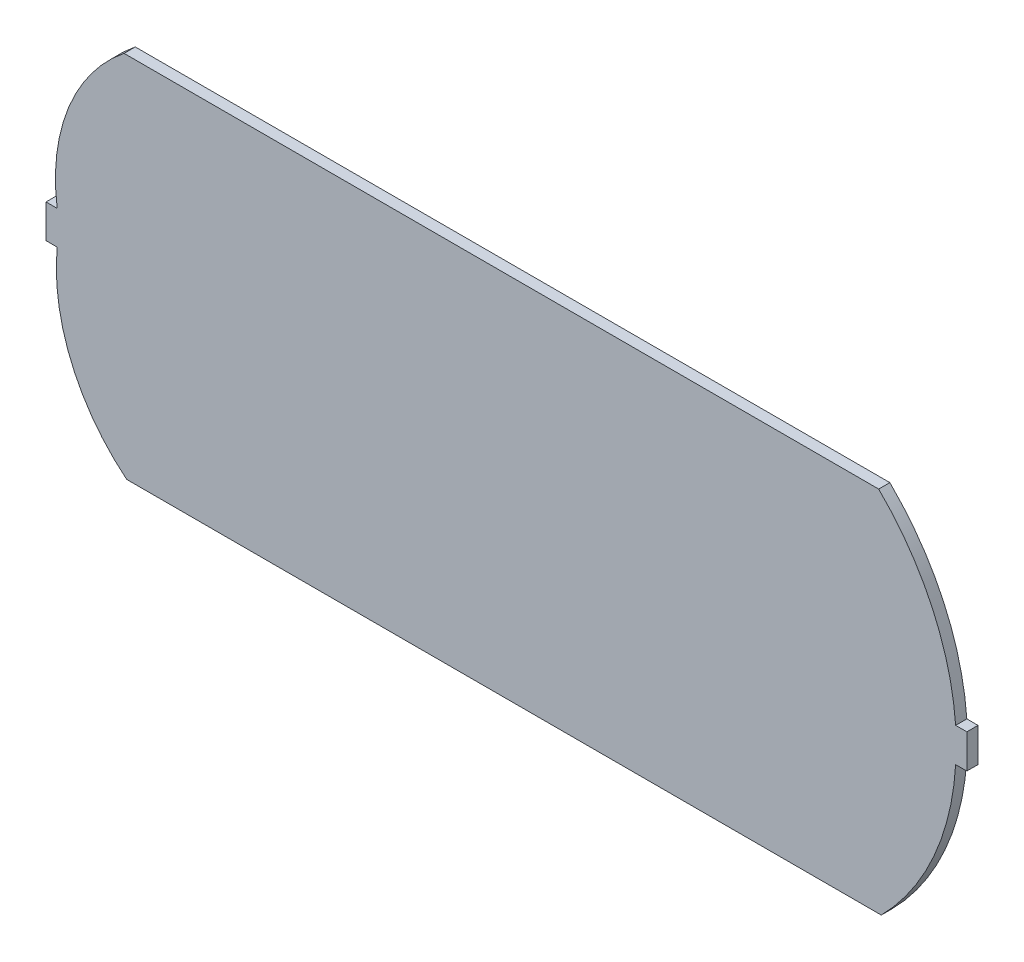
ISO-10303-21;
HEADER;
FILE_DESCRIPTION(('STEP AP214'),'2;1');
FILE_NAME('part.step','',(''),(''),'','','');
FILE_SCHEMA(('AUTOMOTIVE_DESIGN { 1 0 10303 214 1 1 1 1 }'));
ENDSEC;
DATA;
#1=APPLICATION_CONTEXT('core data for automotive mechanical design processes');
#2=APPLICATION_PROTOCOL_DEFINITION('international standard','automotive_design',2000,#1);
#3=PRODUCT_CONTEXT('',#1,'mechanical');
#4=PRODUCT('Part','Part','',(#3));
#5=PRODUCT_RELATED_PRODUCT_CATEGORY('part','',(#4));
#6=PRODUCT_DEFINITION_FORMATION('','',#4);
#7=PRODUCT_DEFINITION_CONTEXT('part definition',#1,'design');
#8=PRODUCT_DEFINITION('design','',#6,#7);
#9=PRODUCT_DEFINITION_SHAPE('','',#8);
#10=(LENGTH_UNIT() NAMED_UNIT(*) SI_UNIT(.MILLI.,.METRE.));
#11=(NAMED_UNIT(*) PLANE_ANGLE_UNIT() SI_UNIT($,.RADIAN.));
#12=(NAMED_UNIT(*) SI_UNIT($,.STERADIAN.) SOLID_ANGLE_UNIT());
#13=UNCERTAINTY_MEASURE_WITH_UNIT(LENGTH_MEASURE(1.E-05),#10,'distance_accuracy_value','');
#14=(GEOMETRIC_REPRESENTATION_CONTEXT(3) GLOBAL_UNCERTAINTY_ASSIGNED_CONTEXT((#13)) GLOBAL_UNIT_ASSIGNED_CONTEXT((#10,
#11,#12)) REPRESENTATION_CONTEXT('',''));
#15=CARTESIAN_POINT('',(0.,0.,0.));
#16=DIRECTION('',(0.,0.,1.));
#17=DIRECTION('',(1.,0.,0.));
#18=AXIS2_PLACEMENT_3D('',#15,#16,#17);
#19=CARTESIAN_POINT('',(0.,-18.8501046672825,1.));
#20=DIRECTION('',(0.,-1.,0.));
#21=DIRECTION('',(0.,0.,-1.));
#22=AXIS2_PLACEMENT_3D('',#19,#20,#21);
#23=PLANE('',#22);
#24=DIRECTION('',(-1.,0.,0.));
#25=VECTOR('',#24,1.);
#26=CARTESIAN_POINT('',(0.,-18.8501046672825,0.));
#27=LINE('',#26,#25);
#28=CARTESIAN_POINT('',(14.4606749125582,-18.8501046672825,0.));
#29=VERTEX_POINT('',#28);
#30=CARTESIAN_POINT('',(13.4606749125582,-18.8501046672825,0.));
#31=VERTEX_POINT('',#30);
#32=EDGE_CURVE('E152',#29,#31,#27,.T.);
#33=ORIENTED_EDGE('',*,*,#32,.F.);
#34=DIRECTION('',(0.,0.,-1.));
#35=VECTOR('',#34,1.);
#36=CARTESIAN_POINT('',(14.4606749125582,-18.8501046672825,1.));
#37=LINE('',#36,#35);
#38=CARTESIAN_POINT('',(14.4606749125582,-18.8501046672825,1.));
#39=VERTEX_POINT('',#38);
#40=EDGE_CURVE('E11',#39,#29,#37,.T.);
#41=ORIENTED_EDGE('',*,*,#40,.F.);
#42=DIRECTION('',(-1.,0.,0.));
#43=VECTOR('',#42,1.);
#44=CARTESIAN_POINT('',(0.,-18.8501046672825,1.));
#45=LINE('',#44,#43);
#46=CARTESIAN_POINT('',(13.4606749125582,-18.8501046672825,1.));
#47=VERTEX_POINT('',#46);
#48=EDGE_CURVE('E182',#39,#47,#45,.T.);
#49=ORIENTED_EDGE('',*,*,#48,.T.);
#50=DIRECTION('',(0.,0.,-1.));
#51=VECTOR('',#50,1.);
#52=CARTESIAN_POINT('',(13.4606749125582,-18.8501046672825,1.));
#53=LINE('',#52,#51);
#54=EDGE_CURVE('E50',#47,#31,#53,.T.);
#55=ORIENTED_EDGE('',*,*,#54,.T.);
#56=EDGE_LOOP('',(#33,#41,#49,#55));
#57=FACE_BOUND('',#56,.T.);
#58=ADVANCED_FACE('F34',(#57),#23,.T.);
#59=CARTESIAN_POINT('',(31.4749559150568,-20.4889749515505,1.));
#60=DIRECTION('',(0.,0.,-1.));
#61=DIRECTION('',(-1.,0.,0.));
#62=AXIS2_PLACEMENT_3D('',#59,#60,#61);
#63=CYLINDRICAL_SURFACE('',#62,17.0930293933125);
#64=CARTESIAN_POINT('',(31.4749559150568,-20.4889749515505,0.));
#65=DIRECTION('',(0.,0.,1.));
#66=DIRECTION('',(1.,0.,0.));
#67=AXIS2_PLACEMENT_3D('',#64,#65,#66);
#68=CIRCLE('',#67,17.0930293933125);
#69=CARTESIAN_POINT('',(20.6760281548959,-33.7386848756006,0.));
#70=VERTEX_POINT('',#69);
#71=EDGE_CURVE('E154',#29,#70,#68,.T.);
#72=ORIENTED_EDGE('',*,*,#71,.T.);
#73=DIRECTION('',(0.,0.,-1.));
#74=VECTOR('',#73,1.);
#75=CARTESIAN_POINT('',(20.6760281548959,-33.7386848756006,1.));
#76=LINE('',#75,#74);
#77=CARTESIAN_POINT('',(20.6760281548959,-33.7386848756006,1.));
#78=VERTEX_POINT('',#77);
#79=EDGE_CURVE('E42',#78,#70,#76,.T.);
#80=ORIENTED_EDGE('',*,*,#79,.F.);
#81=CARTESIAN_POINT('',(31.4749559150568,-20.4889749515505,1.));
#82=DIRECTION('',(0.,0.,1.));
#83=DIRECTION('',(1.,0.,0.));
#84=AXIS2_PLACEMENT_3D('',#81,#82,#83);
#85=CIRCLE('',#84,17.0930293933125);
#86=EDGE_CURVE('E224',#39,#78,#85,.T.);
#87=ORIENTED_EDGE('',*,*,#86,.F.);
#88=ORIENTED_EDGE('',*,*,#40,.T.);
#89=EDGE_LOOP('',(#72,#80,#87,#88));
#90=FACE_BOUND('',#89,.T.);
#91=ADVANCED_FACE('F248',(#90),#63,.T.);
#92=CARTESIAN_POINT('',(0.,-33.7386848756006,1.));
#93=DIRECTION('',(0.,1.,0.));
#94=DIRECTION('',(0.,0.,1.));
#95=AXIS2_PLACEMENT_3D('',#92,#93,#94);
#96=PLANE('',#95);
#97=DIRECTION('',(1.,0.,0.));
#98=VECTOR('',#97,1.);
#99=CARTESIAN_POINT('',(0.,-33.7386848756006,0.));
#100=LINE('',#99,#98);
#101=CARTESIAN_POINT('',(88.1760281548959,-33.7386848756006,0.));
#102=VERTEX_POINT('',#101);
#103=EDGE_CURVE('E156',#70,#102,#100,.T.);
#104=ORIENTED_EDGE('',*,*,#103,.T.);
#105=DIRECTION('',(0.,0.,-1.));
#106=VECTOR('',#105,1.);
#107=CARTESIAN_POINT('',(88.1760281548959,-33.7386848756006,1.));
#108=LINE('',#107,#106);
#109=CARTESIAN_POINT('',(88.1760281548959,-33.7386848756006,1.));
#110=VERTEX_POINT('',#109);
#111=EDGE_CURVE('E197',#110,#102,#108,.T.);
#112=ORIENTED_EDGE('',*,*,#111,.F.);
#113=DIRECTION('',(1.,0.,0.));
#114=VECTOR('',#113,1.);
#115=CARTESIAN_POINT('',(0.,-33.7386848756006,1.));
#116=LINE('',#115,#114);
#117=EDGE_CURVE('E205',#78,#110,#116,.T.);
#118=ORIENTED_EDGE('',*,*,#117,.F.);
#119=ORIENTED_EDGE('',*,*,#79,.T.);
#120=EDGE_LOOP('',(#104,#112,#118,#119));
#121=FACE_BOUND('',#120,.T.);
#122=ADVANCED_FACE('F203',(#121),#96,.F.);
#123=CARTESIAN_POINT('',(71.6395615232934,-17.4281476501808,1.));
#124=DIRECTION('',(0.,0.,-1.));
#125=DIRECTION('',(-1.,0.,0.));
#126=AXIS2_PLACEMENT_3D('',#123,#124,#125);
#127=CYLINDRICAL_SURFACE('',#126,23.2268885828453);
#128=CARTESIAN_POINT('',(71.6395615232934,-17.4281476501808,0.));
#129=DIRECTION('',(0.,0.,1.));
#130=DIRECTION('',(1.,0.,0.));
#131=AXIS2_PLACEMENT_3D('',#128,#129,#130);
#132=CIRCLE('',#131,23.2268885828453);
#133=CARTESIAN_POINT('',(94.8284421492787,-18.7563677199406,0.));
#134=VERTEX_POINT('',#133);
#135=EDGE_CURVE('E159',#134,#102,#132,.F.);
#136=ORIENTED_EDGE('',*,*,#135,.F.);
#137=DIRECTION('',(0.,0.,-1.));
#138=VECTOR('',#137,1.);
#139=CARTESIAN_POINT('',(94.8284421492787,-18.7563677199406,1.));
#140=LINE('',#139,#138);
#141=CARTESIAN_POINT('',(94.8284421492787,-18.7563677199406,1.));
#142=VERTEX_POINT('',#141);
#143=EDGE_CURVE('E195',#142,#134,#140,.T.);
#144=ORIENTED_EDGE('',*,*,#143,.F.);
#145=CARTESIAN_POINT('',(71.6395615232934,-17.4281476501808,1.));
#146=DIRECTION('',(0.,0.,1.));
#147=DIRECTION('',(1.,0.,0.));
#148=AXIS2_PLACEMENT_3D('',#145,#146,#147);
#149=CIRCLE('',#148,23.2268885828453);
#150=EDGE_CURVE('E217',#142,#110,#149,.F.);
#151=ORIENTED_EDGE('',*,*,#150,.T.);
#152=ORIENTED_EDGE('',*,*,#111,.T.);
#153=EDGE_LOOP('',(#136,#144,#151,#152));
#154=FACE_BOUND('',#153,.T.);
#155=ADVANCED_FACE('F214',(#154),#127,.T.);
#156=CARTESIAN_POINT('',(0.,-18.7563677199406,1.));
#157=DIRECTION('',(0.,-1.,0.));
#158=DIRECTION('',(0.,0.,-1.));
#159=AXIS2_PLACEMENT_3D('',#156,#157,#158);
#160=PLANE('',#159);
#161=DIRECTION('',(-1.,0.,0.));
#162=VECTOR('',#161,1.);
#163=CARTESIAN_POINT('',(0.,-18.7563677199406,0.));
#164=LINE('',#163,#162);
#165=CARTESIAN_POINT('',(95.8284421492787,-18.7563677199406,0.));
#166=VERTEX_POINT('',#165);
#167=EDGE_CURVE('E162',#166,#134,#164,.T.);
#168=ORIENTED_EDGE('',*,*,#167,.F.);
#169=DIRECTION('',(0.,0.,-1.));
#170=VECTOR('',#169,1.);
#171=CARTESIAN_POINT('',(95.8284421492787,-18.7563677199406,1.));
#172=LINE('',#171,#170);
#173=CARTESIAN_POINT('',(95.8284421492787,-18.7563677199406,1.));
#174=VERTEX_POINT('',#173);
#175=EDGE_CURVE('E193',#174,#166,#172,.T.);
#176=ORIENTED_EDGE('',*,*,#175,.F.);
#177=DIRECTION('',(-1.,0.,0.));
#178=VECTOR('',#177,1.);
#179=CARTESIAN_POINT('',(0.,-18.7563677199406,1.));
#180=LINE('',#179,#178);
#181=EDGE_CURVE('E220',#174,#142,#180,.T.);
#182=ORIENTED_EDGE('',*,*,#181,.T.);
#183=ORIENTED_EDGE('',*,*,#143,.T.);
#184=EDGE_LOOP('',(#168,#176,#182,#183));
#185=FACE_BOUND('',#184,.T.);
#186=ADVANCED_FACE('F259',(#185),#160,.T.);
#187=CARTESIAN_POINT('',(95.8284421492787,0.,1.));
#188=DIRECTION('',(-1.,0.,0.));
#189=DIRECTION('',(0.,0.,1.));
#190=AXIS2_PLACEMENT_3D('',#187,#188,#189);
#191=PLANE('',#190);
#192=DIRECTION('',(0.,1.,0.));
#193=VECTOR('',#192,1.);
#194=CARTESIAN_POINT('',(95.8284421492787,0.,0.));
#195=LINE('',#194,#193);
#196=CARTESIAN_POINT('',(95.8284421492787,-15.7150949779236,0.));
#197=VERTEX_POINT('',#196);
#198=EDGE_CURVE('E165',#166,#197,#195,.T.);
#199=ORIENTED_EDGE('',*,*,#198,.T.);
#200=DIRECTION('',(0.,0.,-1.));
#201=VECTOR('',#200,1.);
#202=CARTESIAN_POINT('',(95.8284421492787,-15.7150949779236,1.));
#203=LINE('',#202,#201);
#204=CARTESIAN_POINT('',(95.8284421492787,-15.7150949779236,1.));
#205=VERTEX_POINT('',#204);
#206=EDGE_CURVE('E190',#205,#197,#203,.T.);
#207=ORIENTED_EDGE('',*,*,#206,.F.);
#208=DIRECTION('',(0.,1.,0.));
#209=VECTOR('',#208,1.);
#210=CARTESIAN_POINT('',(95.8284421492787,0.,1.));
#211=LINE('',#210,#209);
#212=EDGE_CURVE('E222',#174,#205,#211,.T.);
#213=ORIENTED_EDGE('',*,*,#212,.F.);
#214=ORIENTED_EDGE('',*,*,#175,.T.);
#215=EDGE_LOOP('',(#199,#207,#213,#214));
#216=FACE_BOUND('',#215,.T.);
#217=ADVANCED_FACE('F262',(#216),#191,.F.);
#218=CARTESIAN_POINT('',(0.,-15.7150949779236,1.));
#219=DIRECTION('',(0.,-1.,0.));
#220=DIRECTION('',(0.,0.,-1.));
#221=AXIS2_PLACEMENT_3D('',#218,#219,#220);
#222=PLANE('',#221);
#223=DIRECTION('',(-1.,0.,0.));
#224=VECTOR('',#223,1.);
#225=CARTESIAN_POINT('',(0.,-15.7150949779236,0.));
#226=LINE('',#225,#224);
#227=CARTESIAN_POINT('',(94.8284421492787,-15.7150949779236,0.));
#228=VERTEX_POINT('',#227);
#229=EDGE_CURVE('E167',#197,#228,#226,.T.);
#230=ORIENTED_EDGE('',*,*,#229,.T.);
#231=DIRECTION('',(0.,0.,-1.));
#232=VECTOR('',#231,1.);
#233=CARTESIAN_POINT('',(94.8284421492787,-15.7150949779236,1.));
#234=LINE('',#233,#232);
#235=CARTESIAN_POINT('',(94.8284421492787,-15.7150949779236,1.));
#236=VERTEX_POINT('',#235);
#237=EDGE_CURVE('E188',#236,#228,#234,.T.);
#238=ORIENTED_EDGE('',*,*,#237,.F.);
#239=DIRECTION('',(-1.,0.,0.));
#240=VECTOR('',#239,1.);
#241=CARTESIAN_POINT('',(0.,-15.7150949779236,1.));
#242=LINE('',#241,#240);
#243=EDGE_CURVE('E229',#205,#236,#242,.T.);
#244=ORIENTED_EDGE('',*,*,#243,.F.);
#245=ORIENTED_EDGE('',*,*,#206,.T.);
#246=EDGE_LOOP('',(#230,#238,#244,#245));
#247=FACE_BOUND('',#246,.T.);
#248=ADVANCED_FACE('F266',(#247),#222,.F.);
#249=CARTESIAN_POINT('',(71.6395615232934,-17.4281476501808,1.));
#250=DIRECTION('',(0.,0.,-1.));
#251=DIRECTION('',(-1.,0.,0.));
#252=AXIS2_PLACEMENT_3D('',#249,#250,#251);
#253=CYLINDRICAL_SURFACE('',#252,23.2520694593862);
#254=CARTESIAN_POINT('',(71.6395615232934,-17.4281476501808,0.));
#255=DIRECTION('',(0.,0.,1.));
#256=DIRECTION('',(1.,0.,0.));
#257=AXIS2_PLACEMENT_3D('',#254,#255,#256);
#258=CIRCLE('',#257,23.2520694593862);
#259=CARTESIAN_POINT('',(87.9445627162026,-0.85088399650882,0.));
#260=VERTEX_POINT('',#259);
#261=EDGE_CURVE('E170',#260,#228,#258,.F.);
#262=ORIENTED_EDGE('',*,*,#261,.F.);
#263=DIRECTION('',(0.,0.,-1.));
#264=VECTOR('',#263,1.);
#265=CARTESIAN_POINT('',(87.9445627162026,-0.85088399650882,1.));
#266=LINE('',#265,#264);
#267=CARTESIAN_POINT('',(87.9445627162026,-0.85088399650882,1.));
#268=VERTEX_POINT('',#267);
#269=EDGE_CURVE('E186',#268,#260,#266,.T.);
#270=ORIENTED_EDGE('',*,*,#269,.F.);
#271=CARTESIAN_POINT('',(71.6395615232934,-17.4281476501808,1.));
#272=DIRECTION('',(0.,0.,1.));
#273=DIRECTION('',(1.,0.,0.));
#274=AXIS2_PLACEMENT_3D('',#271,#272,#273);
#275=CIRCLE('',#274,23.2520694593862);
#276=EDGE_CURVE('E231',#268,#236,#275,.F.);
#277=ORIENTED_EDGE('',*,*,#276,.T.);
#278=ORIENTED_EDGE('',*,*,#237,.T.);
#279=EDGE_LOOP('',(#262,#270,#277,#278));
#280=FACE_BOUND('',#279,.T.);
#281=ADVANCED_FACE('F270',(#280),#253,.T.);
#282=CARTESIAN_POINT('',(0.,-0.85088399650882,1.));
#283=DIRECTION('',(0.,1.,0.));
#284=DIRECTION('',(0.,0.,1.));
#285=AXIS2_PLACEMENT_3D('',#282,#283,#284);
#286=PLANE('',#285);
#287=DIRECTION('',(1.,0.,0.));
#288=VECTOR('',#287,1.);
#289=CARTESIAN_POINT('',(0.,-0.85088399650882,0.));
#290=LINE('',#289,#288);
#291=CARTESIAN_POINT('',(20.4445627162026,-0.85088399650882,0.));
#292=VERTEX_POINT('',#291);
#293=EDGE_CURVE('E173',#292,#260,#290,.T.);
#294=ORIENTED_EDGE('',*,*,#293,.F.);
#295=DIRECTION('',(0.,0.,-1.));
#296=VECTOR('',#295,1.);
#297=CARTESIAN_POINT('',(20.4445627162026,-0.85088399650882,1.));
#298=LINE('',#297,#296);
#299=CARTESIAN_POINT('',(20.4445627162026,-0.85088399650882,1.));
#300=VERTEX_POINT('',#299);
#301=EDGE_CURVE('E144',#300,#292,#298,.T.);
#302=ORIENTED_EDGE('',*,*,#301,.F.);
#303=DIRECTION('',(1.,0.,0.));
#304=VECTOR('',#303,1.);
#305=CARTESIAN_POINT('',(0.,-0.85088399650882,1.));
#306=LINE('',#305,#304);
#307=EDGE_CURVE('E134',#300,#268,#306,.T.);
#308=ORIENTED_EDGE('',*,*,#307,.T.);
#309=ORIENTED_EDGE('',*,*,#269,.T.);
#310=EDGE_LOOP('',(#294,#302,#308,#309));
#311=FACE_BOUND('',#310,.T.);
#312=ADVANCED_FACE('F235',(#311),#286,.T.);
#313=CARTESIAN_POINT('',(30.6292258965773,-13.6072566759693,1.));
#314=DIRECTION('',(0.,0.,-1.));
#315=DIRECTION('',(-1.,0.,0.));
#316=AXIS2_PLACEMENT_3D('',#313,#314,#315);
#317=CYLINDRICAL_SURFACE('',#316,16.323369996265);
#318=CARTESIAN_POINT('',(30.6292258965773,-13.6072566759693,0.));
#319=DIRECTION('',(0.,0.,1.));
#320=DIRECTION('',(1.,0.,0.));
#321=AXIS2_PLACEMENT_3D('',#318,#319,#320);
#322=CIRCLE('',#321,16.323369996265);
#323=CARTESIAN_POINT('',(14.4606749125582,-15.8501046672825,0.));
#324=VERTEX_POINT('',#323);
#325=EDGE_CURVE('E141',#292,#324,#322,.T.);
#326=ORIENTED_EDGE('',*,*,#325,.T.);
#327=DIRECTION('',(0.,0.,-1.));
#328=VECTOR('',#327,1.);
#329=CARTESIAN_POINT('',(14.4606749125582,-15.8501046672825,1.));
#330=LINE('',#329,#328);
#331=CARTESIAN_POINT('',(14.4606749125582,-15.8501046672825,1.));
#332=VERTEX_POINT('',#331);
#333=EDGE_CURVE('E138',#332,#324,#330,.T.);
#334=ORIENTED_EDGE('',*,*,#333,.F.);
#335=CARTESIAN_POINT('',(30.6292258965773,-13.6072566759693,1.));
#336=DIRECTION('',(0.,0.,1.));
#337=DIRECTION('',(1.,0.,0.));
#338=AXIS2_PLACEMENT_3D('',#335,#336,#337);
#339=CIRCLE('',#338,16.323369996265);
#340=EDGE_CURVE('E125',#300,#332,#339,.T.);
#341=ORIENTED_EDGE('',*,*,#340,.F.);
#342=ORIENTED_EDGE('',*,*,#301,.T.);
#343=EDGE_LOOP('',(#326,#334,#341,#342));
#344=FACE_BOUND('',#343,.T.);
#345=ADVANCED_FACE('F139',(#344),#317,.T.);
#346=CARTESIAN_POINT('',(0.,-15.8501046672825,1.));
#347=DIRECTION('',(0.,-1.,0.));
#348=DIRECTION('',(0.,0.,-1.));
#349=AXIS2_PLACEMENT_3D('',#346,#347,#348);
#350=PLANE('',#349);
#351=DIRECTION('',(-1.,0.,0.));
#352=VECTOR('',#351,1.);
#353=CARTESIAN_POINT('',(0.,-15.8501046672825,0.));
#354=LINE('',#353,#352);
#355=CARTESIAN_POINT('',(13.4606749125582,-15.8501046672825,0.));
#356=VERTEX_POINT('',#355);
#357=EDGE_CURVE('E177',#324,#356,#354,.T.);
#358=ORIENTED_EDGE('',*,*,#357,.T.);
#359=DIRECTION('',(0.,0.,-1.));
#360=VECTOR('',#359,1.);
#361=CARTESIAN_POINT('',(13.4606749125582,-15.8501046672825,1.));
#362=LINE('',#361,#360);
#363=CARTESIAN_POINT('',(13.4606749125582,-15.8501046672825,1.));
#364=VERTEX_POINT('',#363);
#365=EDGE_CURVE('E88',#364,#356,#362,.T.);
#366=ORIENTED_EDGE('',*,*,#365,.F.);
#367=DIRECTION('',(-1.,0.,0.));
#368=VECTOR('',#367,1.);
#369=CARTESIAN_POINT('',(0.,-15.8501046672825,1.));
#370=LINE('',#369,#368);
#371=EDGE_CURVE('E131',#332,#364,#370,.T.);
#372=ORIENTED_EDGE('',*,*,#371,.F.);
#373=ORIENTED_EDGE('',*,*,#333,.T.);
#374=EDGE_LOOP('',(#358,#366,#372,#373));
#375=FACE_BOUND('',#374,.T.);
#376=ADVANCED_FACE('F146',(#375),#350,.F.);
#377=CARTESIAN_POINT('',(13.4606749125581,0.,1.));
#378=DIRECTION('',(-1.,0.,0.));
#379=DIRECTION('',(0.,-1.,0.));
#380=AXIS2_PLACEMENT_3D('',#377,#378,#379);
#381=PLANE('',#380);
#382=DIRECTION('',(0.,1.,0.));
#383=VECTOR('',#382,1.);
#384=CARTESIAN_POINT('',(13.4606749125581,0.,0.));
#385=LINE('',#384,#383);
#386=EDGE_CURVE('E179',#31,#356,#385,.T.);
#387=ORIENTED_EDGE('',*,*,#386,.F.);
#388=ORIENTED_EDGE('',*,*,#54,.F.);
#389=DIRECTION('',(0.,1.,0.));
#390=VECTOR('',#389,1.);
#391=CARTESIAN_POINT('',(13.4606749125581,0.,1.));
#392=LINE('',#391,#390);
#393=EDGE_CURVE('E147',#47,#364,#392,.T.);
#394=ORIENTED_EDGE('',*,*,#393,.T.);
#395=ORIENTED_EDGE('',*,*,#365,.T.);
#396=EDGE_LOOP('',(#387,#388,#394,#395));
#397=FACE_BOUND('',#396,.T.);
#398=ADVANCED_FACE('F237',(#397),#381,.T.);
#399=CARTESIAN_POINT('',(0.,0.,1.));
#400=DIRECTION('',(0.,0.,1.));
#401=DIRECTION('',(1.,0.,0.));
#402=AXIS2_PLACEMENT_3D('',#399,#400,#401);
#403=PLANE('',#402);
#404=ORIENTED_EDGE('',*,*,#48,.F.);
#405=ORIENTED_EDGE('',*,*,#86,.T.);
#406=ORIENTED_EDGE('',*,*,#117,.T.);
#407=ORIENTED_EDGE('',*,*,#150,.F.);
#408=ORIENTED_EDGE('',*,*,#181,.F.);
#409=ORIENTED_EDGE('',*,*,#212,.T.);
#410=ORIENTED_EDGE('',*,*,#243,.T.);
#411=ORIENTED_EDGE('',*,*,#276,.F.);
#412=ORIENTED_EDGE('',*,*,#307,.F.);
#413=ORIENTED_EDGE('',*,*,#340,.T.);
#414=ORIENTED_EDGE('',*,*,#371,.T.);
#415=ORIENTED_EDGE('',*,*,#393,.F.);
#416=EDGE_LOOP('',(#404,#405,#406,#407,#408,#409,#410,#411,#412,#413,#414,#415));
#417=FACE_BOUND('',#416,.T.);
#418=ADVANCED_FACE('F128',(#417),#403,.T.);
#419=CARTESIAN_POINT('',(0.,0.,0.));
#420=DIRECTION('',(0.,0.,1.));
#421=DIRECTION('',(1.,0.,0.));
#422=AXIS2_PLACEMENT_3D('',#419,#420,#421);
#423=PLANE('',#422);
#424=ORIENTED_EDGE('',*,*,#32,.T.);
#425=ORIENTED_EDGE('',*,*,#386,.T.);
#426=ORIENTED_EDGE('',*,*,#357,.F.);
#427=ORIENTED_EDGE('',*,*,#325,.F.);
#428=ORIENTED_EDGE('',*,*,#293,.T.);
#429=ORIENTED_EDGE('',*,*,#261,.T.);
#430=ORIENTED_EDGE('',*,*,#229,.F.);
#431=ORIENTED_EDGE('',*,*,#198,.F.);
#432=ORIENTED_EDGE('',*,*,#167,.T.);
#433=ORIENTED_EDGE('',*,*,#135,.T.);
#434=ORIENTED_EDGE('',*,*,#103,.F.);
#435=ORIENTED_EDGE('',*,*,#71,.F.);
#436=EDGE_LOOP('',(#424,#425,#426,#427,#428,#429,#430,#431,#432,#433,#434,#435));
#437=FACE_BOUND('',#436,.T.);
#438=ADVANCED_FACE('F209',(#437),#423,.F.);
#439=CLOSED_SHELL('',(#58,#91,#122,#155,#186,#217,#248,#281,#312,#345,#376,#398,#418,#438));
#440=MANIFOLD_SOLID_BREP('B2',#439);
#441=ADVANCED_BREP_SHAPE_REPRESENTATION('',(#18,#440),#14);
#442=SHAPE_DEFINITION_REPRESENTATION(#9,#441);
ENDSEC;
END-ISO-10303-21;
